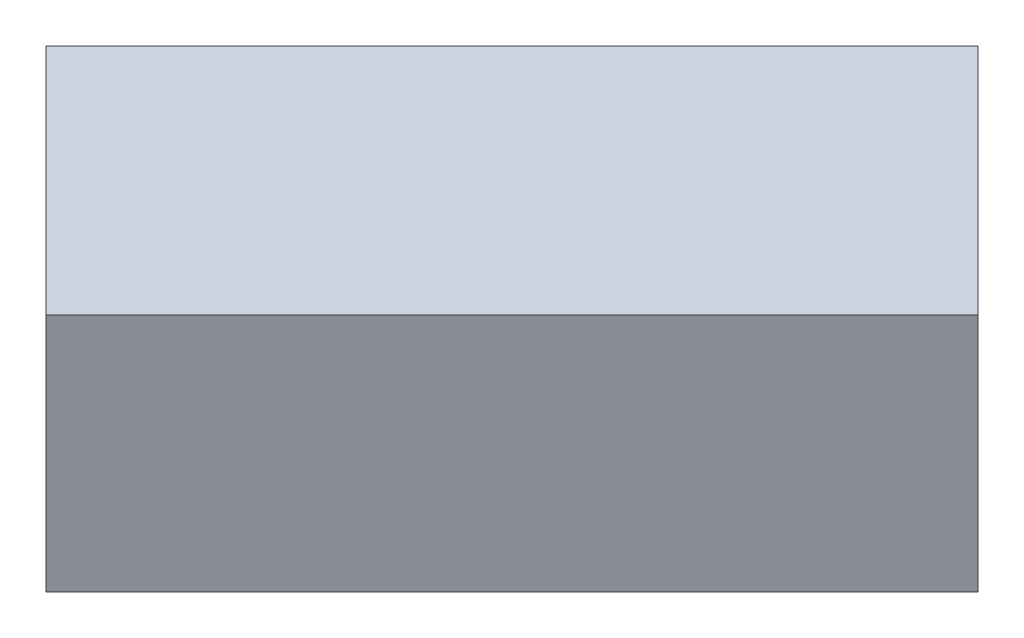
ISO-10303-21;
HEADER;
FILE_DESCRIPTION(('STEP AP214'),'2;1');
FILE_NAME('part.step','',(''),(''),'','','');
FILE_SCHEMA(('AUTOMOTIVE_DESIGN { 1 0 10303 214 1 1 1 1 }'));
ENDSEC;
DATA;
#1=APPLICATION_CONTEXT('core data for automotive mechanical design processes');
#2=APPLICATION_PROTOCOL_DEFINITION('international standard','automotive_design',2000,#1);
#3=PRODUCT_CONTEXT('',#1,'mechanical');
#4=PRODUCT('Part','Part','',(#3));
#5=PRODUCT_RELATED_PRODUCT_CATEGORY('part','',(#4));
#6=PRODUCT_DEFINITION_FORMATION('','',#4);
#7=PRODUCT_DEFINITION_CONTEXT('part definition',#1,'design');
#8=PRODUCT_DEFINITION('design','',#6,#7);
#9=PRODUCT_DEFINITION_SHAPE('','',#8);
#10=(LENGTH_UNIT() NAMED_UNIT(*) SI_UNIT(.MILLI.,.METRE.));
#11=(NAMED_UNIT(*) PLANE_ANGLE_UNIT() SI_UNIT($,.RADIAN.));
#12=(NAMED_UNIT(*) SI_UNIT($,.STERADIAN.) SOLID_ANGLE_UNIT());
#13=UNCERTAINTY_MEASURE_WITH_UNIT(LENGTH_MEASURE(1.E-05),#10,'distance_accuracy_value','');
#14=(GEOMETRIC_REPRESENTATION_CONTEXT(3) GLOBAL_UNCERTAINTY_ASSIGNED_CONTEXT((#13)) GLOBAL_UNIT_ASSIGNED_CONTEXT((#10,
#11,#12)) REPRESENTATION_CONTEXT('',''));
#15=CARTESIAN_POINT('',(0.,0.,0.));
#16=DIRECTION('',(0.,0.,1.));
#17=DIRECTION('',(1.,0.,0.));
#18=AXIS2_PLACEMENT_3D('',#15,#16,#17);
#19=CARTESIAN_POINT('',(0.,3.305,0.));
#20=DIRECTION('',(0.,-1.,0.));
#21=DIRECTION('',(0.,0.,-1.));
#22=AXIS2_PLACEMENT_3D('',#19,#20,#21);
#23=PLANE('',#22);
#24=DIRECTION('',(0.707106781186548,0.,0.707106781186547));
#25=VECTOR('',#24,1.);
#26=CARTESIAN_POINT('',(17.1989087296526,3.305,1.94327381104219));
#27=LINE('',#26,#25);
#28=CARTESIAN_POINT('',(17.1989087296526,3.305,1.94327381104219));
#29=VERTEX_POINT('',#28);
#30=CARTESIAN_POINT('',(17.9767261889578,3.305,2.7210912703474));
#31=VERTEX_POINT('',#30);
#32=EDGE_CURVE('E11',#29,#31,#27,.T.);
#33=ORIENTED_EDGE('',*,*,#32,.T.);
#34=DIRECTION('',(-0.707106781186548,0.,0.707106781186548));
#35=VECTOR('',#34,1.);
#36=CARTESIAN_POINT('',(17.9767261889578,3.305,2.7210912703474));
#37=LINE('',#36,#35);
#38=CARTESIAN_POINT('',(16.4210912703474,3.305,4.2767261889578));
#39=VERTEX_POINT('',#38);
#40=EDGE_CURVE('E24',#31,#39,#37,.T.);
#41=ORIENTED_EDGE('',*,*,#40,.T.);
#42=DIRECTION('',(-0.707106781186548,0.,-0.707106781186547));
#43=VECTOR('',#42,1.);
#44=CARTESIAN_POINT('',(16.4210912703474,3.305,4.2767261889578));
#45=LINE('',#44,#43);
#46=CARTESIAN_POINT('',(15.6432738110422,3.305,3.4989087296526));
#47=VERTEX_POINT('',#46);
#48=EDGE_CURVE('E88',#39,#47,#45,.T.);
#49=ORIENTED_EDGE('',*,*,#48,.T.);
#50=DIRECTION('',(0.707106781186547,0.,-0.707106781186548));
#51=VECTOR('',#50,1.);
#52=CARTESIAN_POINT('',(15.6432738110422,3.305,3.4989087296526));
#53=LINE('',#52,#51);
#54=EDGE_CURVE('E59',#47,#29,#53,.T.);
#55=ORIENTED_EDGE('',*,*,#54,.T.);
#56=EDGE_LOOP('',(#33,#41,#49,#55));
#57=FACE_BOUND('',#56,.T.);
#58=ADVANCED_FACE('F17',(#57),#23,.T.);
#59=CARTESIAN_POINT('',(16.4210912703474,4.105,4.2767261889578));
#60=DIRECTION('',(-0.707106781186548,0.,-0.707106781186548));
#61=DIRECTION('',(-0.707106781186548,0.,0.707106781186548));
#62=AXIS2_PLACEMENT_3D('',#59,#60,#61);
#63=PLANE('',#62);
#64=DIRECTION('',(0.,-1.,0.));
#65=VECTOR('',#64,1.);
#66=CARTESIAN_POINT('',(17.9767261889578,4.105,2.7210912703474));
#67=LINE('',#66,#65);
#68=CARTESIAN_POINT('',(17.9767261889578,4.105,2.7210912703474));
#69=VERTEX_POINT('',#68);
#70=EDGE_CURVE('E85',#69,#31,#67,.T.);
#71=ORIENTED_EDGE('',*,*,#70,.F.);
#72=DIRECTION('',(0.707106781186548,0.,-0.707106781186548));
#73=VECTOR('',#72,1.);
#74=CARTESIAN_POINT('',(16.4210912703474,4.105,4.2767261889578));
#75=LINE('',#74,#73);
#76=CARTESIAN_POINT('',(16.4210912703474,4.105,4.2767261889578));
#77=VERTEX_POINT('',#76);
#78=EDGE_CURVE('E83',#77,#69,#75,.T.);
#79=ORIENTED_EDGE('',*,*,#78,.F.);
#80=DIRECTION('',(0.,1.,0.));
#81=VECTOR('',#80,1.);
#82=CARTESIAN_POINT('',(16.4210912703474,4.105,4.2767261889578));
#83=LINE('',#82,#81);
#84=EDGE_CURVE('E76',#39,#77,#83,.T.);
#85=ORIENTED_EDGE('',*,*,#84,.F.);
#86=ORIENTED_EDGE('',*,*,#40,.F.);
#87=EDGE_LOOP('',(#71,#79,#85,#86));
#88=FACE_BOUND('',#87,.T.);
#89=ADVANCED_FACE('F90',(#88),#63,.F.);
#90=CARTESIAN_POINT('',(17.9767261889578,4.105,2.7210912703474));
#91=DIRECTION('',(-0.707106781186547,0.,0.707106781186548));
#92=DIRECTION('',(0.,1.,0.));
#93=AXIS2_PLACEMENT_3D('',#90,#91,#92);
#94=PLANE('',#93);
#95=DIRECTION('',(0.,-1.,0.));
#96=VECTOR('',#95,1.);
#97=CARTESIAN_POINT('',(17.1989087296526,4.105,1.94327381104219));
#98=LINE('',#97,#96);
#99=CARTESIAN_POINT('',(17.1989087296526,4.105,1.94327381104219));
#100=VERTEX_POINT('',#99);
#101=EDGE_CURVE('E80',#100,#29,#98,.T.);
#102=ORIENTED_EDGE('',*,*,#101,.F.);
#103=DIRECTION('',(-0.707106781186548,0.,-0.707106781186547));
#104=VECTOR('',#103,1.);
#105=CARTESIAN_POINT('',(17.9767261889578,4.105,2.7210912703474));
#106=LINE('',#105,#104);
#107=EDGE_CURVE('E63',#69,#100,#106,.T.);
#108=ORIENTED_EDGE('',*,*,#107,.F.);
#109=ORIENTED_EDGE('',*,*,#70,.T.);
#110=ORIENTED_EDGE('',*,*,#32,.F.);
#111=EDGE_LOOP('',(#102,#108,#109,#110));
#112=FACE_BOUND('',#111,.T.);
#113=ADVANCED_FACE('F91',(#112),#94,.F.);
#114=CARTESIAN_POINT('',(15.6432738110422,4.105,3.4989087296526));
#115=DIRECTION('',(0.707106781186548,0.,0.707106781186547));
#116=DIRECTION('',(0.,-1.,0.));
#117=AXIS2_PLACEMENT_3D('',#114,#115,#116);
#118=PLANE('',#117);
#119=DIRECTION('',(0.,-1.,0.));
#120=VECTOR('',#119,1.);
#121=CARTESIAN_POINT('',(15.6432738110422,4.105,3.4989087296526));
#122=LINE('',#121,#120);
#123=CARTESIAN_POINT('',(15.6432738110422,4.105,3.4989087296526));
#124=VERTEX_POINT('',#123);
#125=EDGE_CURVE('E54',#124,#47,#122,.T.);
#126=ORIENTED_EDGE('',*,*,#125,.F.);
#127=DIRECTION('',(-0.707106781186547,0.,0.707106781186548));
#128=VECTOR('',#127,1.);
#129=CARTESIAN_POINT('',(15.6432738110422,4.105,3.4989087296526));
#130=LINE('',#129,#128);
#131=EDGE_CURVE('E58',#100,#124,#130,.T.);
#132=ORIENTED_EDGE('',*,*,#131,.F.);
#133=ORIENTED_EDGE('',*,*,#101,.T.);
#134=ORIENTED_EDGE('',*,*,#54,.F.);
#135=EDGE_LOOP('',(#126,#132,#133,#134));
#136=FACE_BOUND('',#135,.T.);
#137=ADVANCED_FACE('F56',(#136),#118,.F.);
#138=CARTESIAN_POINT('',(16.4210912703474,4.105,4.2767261889578));
#139=DIRECTION('',(0.707106781186547,0.,-0.707106781186548));
#140=DIRECTION('',(0.,-1.,0.));
#141=AXIS2_PLACEMENT_3D('',#138,#139,#140);
#142=PLANE('',#141);
#143=ORIENTED_EDGE('',*,*,#84,.T.);
#144=DIRECTION('',(0.707106781186548,0.,0.707106781186547));
#145=VECTOR('',#144,1.);
#146=CARTESIAN_POINT('',(16.4210912703474,4.105,4.2767261889578));
#147=LINE('',#146,#145);
#148=EDGE_CURVE('E70',#124,#77,#147,.T.);
#149=ORIENTED_EDGE('',*,*,#148,.F.);
#150=ORIENTED_EDGE('',*,*,#125,.T.);
#151=ORIENTED_EDGE('',*,*,#48,.F.);
#152=EDGE_LOOP('',(#143,#149,#150,#151));
#153=FACE_BOUND('',#152,.T.);
#154=ADVANCED_FACE('F74',(#153),#142,.F.);
#155=CARTESIAN_POINT('',(0.,4.105,0.));
#156=DIRECTION('',(0.,-1.,0.));
#157=DIRECTION('',(0.,0.,-1.));
#158=AXIS2_PLACEMENT_3D('',#155,#156,#157);
#159=PLANE('',#158);
#160=ORIENTED_EDGE('',*,*,#78,.T.);
#161=ORIENTED_EDGE('',*,*,#107,.T.);
#162=ORIENTED_EDGE('',*,*,#131,.T.);
#163=ORIENTED_EDGE('',*,*,#148,.T.);
#164=EDGE_LOOP('',(#160,#161,#162,#163));
#165=FACE_BOUND('',#164,.T.);
#166=ADVANCED_FACE('F69',(#165),#159,.F.);
#167=CLOSED_SHELL('',(#58,#89,#113,#137,#154,#166));
#168=MANIFOLD_SOLID_BREP('B1',#167);
#169=ADVANCED_BREP_SHAPE_REPRESENTATION('',(#18,#168),#14);
#170=SHAPE_DEFINITION_REPRESENTATION(#9,#169);
ENDSEC;
END-ISO-10303-21;
